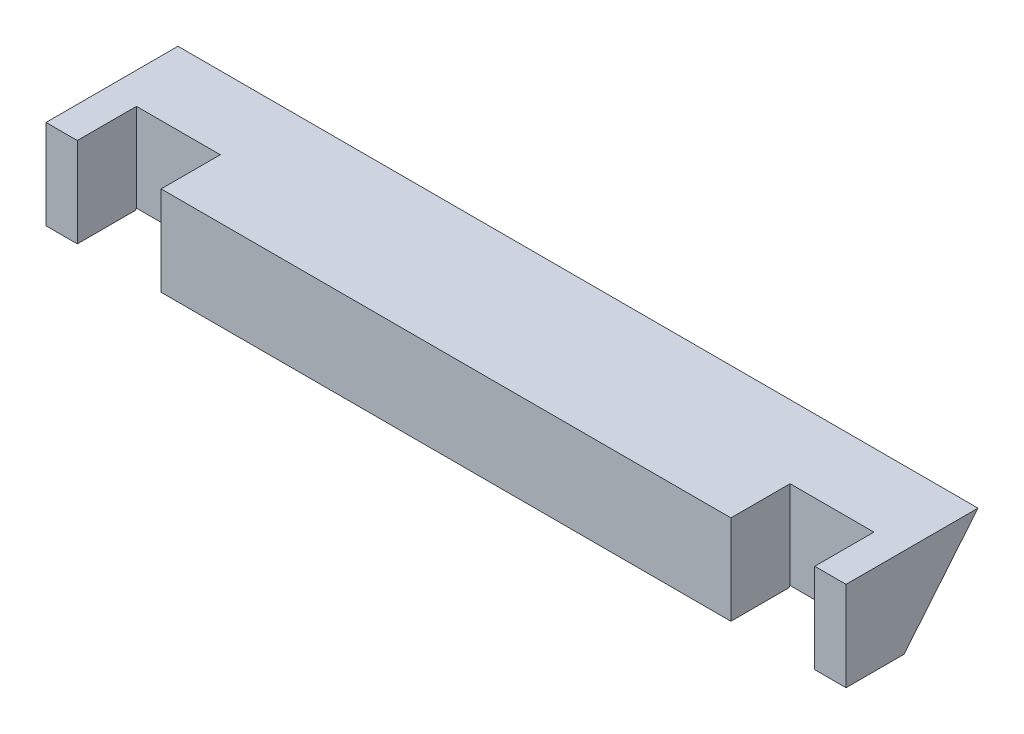
ISO-10303-21;
HEADER;
FILE_DESCRIPTION(('STEP AP214'),'2;1');
FILE_NAME('part.step','',(''),(''),'','','');
FILE_SCHEMA(('AUTOMOTIVE_DESIGN { 1 0 10303 214 1 1 1 1 }'));
ENDSEC;
DATA;
#1=APPLICATION_CONTEXT('core data for automotive mechanical design processes');
#2=APPLICATION_PROTOCOL_DEFINITION('international standard','automotive_design',2000,#1);
#3=PRODUCT_CONTEXT('',#1,'mechanical');
#4=PRODUCT('Part','Part','',(#3));
#5=PRODUCT_RELATED_PRODUCT_CATEGORY('part','',(#4));
#6=PRODUCT_DEFINITION_FORMATION('','',#4);
#7=PRODUCT_DEFINITION_CONTEXT('part definition',#1,'design');
#8=PRODUCT_DEFINITION('design','',#6,#7);
#9=PRODUCT_DEFINITION_SHAPE('','',#8);
#10=(LENGTH_UNIT() NAMED_UNIT(*) SI_UNIT(.MILLI.,.METRE.));
#11=(NAMED_UNIT(*) PLANE_ANGLE_UNIT() SI_UNIT($,.RADIAN.));
#12=(NAMED_UNIT(*) SI_UNIT($,.STERADIAN.) SOLID_ANGLE_UNIT());
#13=UNCERTAINTY_MEASURE_WITH_UNIT(LENGTH_MEASURE(1.E-05),#10,'distance_accuracy_value','');
#14=(GEOMETRIC_REPRESENTATION_CONTEXT(3) GLOBAL_UNCERTAINTY_ASSIGNED_CONTEXT((#13)) GLOBAL_UNIT_ASSIGNED_CONTEXT((#10,
#11,#12)) REPRESENTATION_CONTEXT('',''));
#15=CARTESIAN_POINT('',(0.,0.,0.));
#16=DIRECTION('',(0.,0.,1.));
#17=DIRECTION('',(1.,0.,0.));
#18=AXIS2_PLACEMENT_3D('',#15,#16,#17);
#19=CARTESIAN_POINT('',(0.,-45.987734948605,62.9188192914831));
#20=DIRECTION('',(0.,1.,0.));
#21=DIRECTION('',(0.,0.,1.));
#22=AXIS2_PLACEMENT_3D('',#19,#20,#21);
#23=PLANE('',#22);
#24=DIRECTION('',(1.,0.,0.));
#25=VECTOR('',#24,1.);
#26=CARTESIAN_POINT('',(0.,-45.987734948605,62.9188192914831));
#27=LINE('',#26,#25);
#28=CARTESIAN_POINT('',(667.81,-45.987734948605,62.9188192914831));
#29=VERTEX_POINT('',#28);
#30=CARTESIAN_POINT('',(695.,-45.987734948605,62.9188192914831));
#31=VERTEX_POINT('',#30);
#32=EDGE_CURVE('E205',#29,#31,#27,.T.);
#33=ORIENTED_EDGE('',*,*,#32,.F.);
#34=DIRECTION('',(0.,0.,-1.));
#35=VECTOR('',#34,1.);
#36=CARTESIAN_POINT('',(667.81,-45.987734948605,62.9188192914831));
#37=LINE('',#36,#35);
#38=CARTESIAN_POINT('',(667.81,-45.987734948605,12.5088192914831));
#39=VERTEX_POINT('',#38);
#40=EDGE_CURVE('E173',#29,#39,#37,.T.);
#41=ORIENTED_EDGE('',*,*,#40,.T.);
#42=DIRECTION('',(-1.,0.,0.));
#43=VECTOR('',#42,1.);
#44=CARTESIAN_POINT('',(695.,-45.987734948605,12.5088192914831));
#45=LINE('',#44,#43);
#46=CARTESIAN_POINT('',(695.,-45.987734948605,12.5088192914831));
#47=VERTEX_POINT('',#46);
#48=EDGE_CURVE('E235',#47,#39,#45,.T.);
#49=ORIENTED_EDGE('',*,*,#48,.F.);
#50=DIRECTION('',(0.,0.,-1.));
#51=VECTOR('',#50,1.);
#52=CARTESIAN_POINT('',(695.,-45.987734948605,62.9188192914831));
#53=LINE('',#52,#51);
#54=EDGE_CURVE('E217',#31,#47,#53,.T.);
#55=ORIENTED_EDGE('',*,*,#54,.F.);
#56=EDGE_LOOP('',(#33,#41,#49,#55));
#57=FACE_BOUND('',#56,.T.);
#58=ADVANCED_FACE('F34',(#57),#23,.F.);
#59=CARTESIAN_POINT('',(0.,0.,62.9188192914831));
#60=DIRECTION('',(0.,0.,1.));
#61=DIRECTION('',(1.,0.,0.));
#62=AXIS2_PLACEMENT_3D('',#59,#60,#61);
#63=PLANE('',#62);
#64=DIRECTION('',(0.,1.,0.));
#65=VECTOR('',#64,1.);
#66=CARTESIAN_POINT('',(667.81,-968.177734948605,62.9188192914831));
#67=LINE('',#66,#65);
#68=CARTESIAN_POINT('',(667.81,31.822265051395,62.9188192914831));
#69=VERTEX_POINT('',#68);
#70=EDGE_CURVE('E161',#29,#69,#67,.T.);
#71=ORIENTED_EDGE('',*,*,#70,.F.);
#72=ORIENTED_EDGE('',*,*,#32,.T.);
#73=DIRECTION('',(0.,1.,0.));
#74=VECTOR('',#73,1.);
#75=CARTESIAN_POINT('',(695.,31.822265051395,62.9188192914831));
#76=LINE('',#75,#74);
#77=CARTESIAN_POINT('',(695.,31.822265051395,62.9188192914831));
#78=VERTEX_POINT('',#77);
#79=EDGE_CURVE('E209',#31,#78,#76,.T.);
#80=ORIENTED_EDGE('',*,*,#79,.T.);
#81=DIRECTION('',(-1.,0.,0.));
#82=VECTOR('',#81,1.);
#83=CARTESIAN_POINT('',(0.,31.822265051395,62.9188192914831));
#84=LINE('',#83,#82);
#85=EDGE_CURVE('E214',#78,#69,#84,.T.);
#86=ORIENTED_EDGE('',*,*,#85,.T.);
#87=EDGE_LOOP('',(#71,#72,#80,#86));
#88=FACE_BOUND('',#87,.T.);
#89=ADVANCED_FACE('F270',(#88),#63,.T.);
#90=CARTESIAN_POINT('',(594.99,-45.987734948605,12.5088192914831));
#91=VERTEX_POINT('',#90);
#92=CARTESIAN_POINT('',(100.01,-45.987734948605,12.5088192914831));
#93=VERTEX_POINT('',#92);
#94=EDGE_CURVE('E239',#91,#93,#45,.T.);
#95=ORIENTED_EDGE('',*,*,#94,.F.);
#96=DIRECTION('',(0.,0.,1.));
#97=VECTOR('',#96,1.);
#98=CARTESIAN_POINT('',(594.99,-45.987734948605,62.9188192914831));
#99=LINE('',#98,#97);
#100=CARTESIAN_POINT('',(594.99,-45.987734948605,62.9188192914831));
#101=VERTEX_POINT('',#100);
#102=EDGE_CURVE('E167',#91,#101,#99,.T.);
#103=ORIENTED_EDGE('',*,*,#102,.T.);
#104=CARTESIAN_POINT('',(100.01,-45.987734948605,62.9188192914831));
#105=VERTEX_POINT('',#104);
#106=EDGE_CURVE('E210',#105,#101,#27,.T.);
#107=ORIENTED_EDGE('',*,*,#106,.F.);
#108=DIRECTION('',(0.,0.,-1.));
#109=VECTOR('',#108,1.);
#110=CARTESIAN_POINT('',(100.01,-45.987734948605,62.9188192914831));
#111=LINE('',#110,#109);
#112=EDGE_CURVE('E193',#105,#93,#111,.T.);
#113=ORIENTED_EDGE('',*,*,#112,.T.);
#114=EDGE_LOOP('',(#95,#103,#107,#113));
#115=FACE_BOUND('',#114,.T.);
#116=ADVANCED_FACE('F263',(#115),#23,.F.);
#117=DIRECTION('',(0.,1.,0.));
#118=VECTOR('',#117,1.);
#119=CARTESIAN_POINT('',(594.99,-968.177734948605,62.9188192914831));
#120=LINE('',#119,#118);
#121=CARTESIAN_POINT('',(594.99,31.822265051395,62.9188192914831));
#122=VERTEX_POINT('',#121);
#123=EDGE_CURVE('E145',#101,#122,#120,.T.);
#124=ORIENTED_EDGE('',*,*,#123,.T.);
#125=CARTESIAN_POINT('',(100.01,31.822265051395,62.9188192914831));
#126=VERTEX_POINT('',#125);
#127=EDGE_CURVE('E156',#122,#126,#84,.T.);
#128=ORIENTED_EDGE('',*,*,#127,.T.);
#129=DIRECTION('',(0.,1.,0.));
#130=VECTOR('',#129,1.);
#131=CARTESIAN_POINT('',(100.01,0.,62.9188192914831));
#132=LINE('',#131,#130);
#133=EDGE_CURVE('E11',#105,#126,#132,.T.);
#134=ORIENTED_EDGE('',*,*,#133,.F.);
#135=ORIENTED_EDGE('',*,*,#106,.T.);
#136=EDGE_LOOP('',(#124,#128,#134,#135));
#137=FACE_BOUND('',#136,.T.);
#138=ADVANCED_FACE('F278',(#137),#63,.T.);
#139=CARTESIAN_POINT('',(695.,-45.987734948605,12.5088192914831));
#140=DIRECTION('',(0.,0.636540705826315,0.771243106825686));
#141=DIRECTION('',(0.,-0.771243106825686,0.636540705826315));
#142=AXIS2_PLACEMENT_3D('',#139,#140,#141);
#143=PLANE('',#142);
#144=ORIENTED_EDGE('',*,*,#48,.T.);
#145=DIRECTION('',(0.,0.771243106825686,-0.636540705826315));
#146=VECTOR('',#145,1.);
#147=CARTESIAN_POINT('',(667.81,-45.987734948605,12.5088192914831));
#148=LINE('',#147,#146);
#149=CARTESIAN_POINT('',(667.81,-44.7882347928903,11.5188192914831));
#150=VERTEX_POINT('',#149);
#151=EDGE_CURVE('E170',#39,#150,#148,.T.);
#152=ORIENTED_EDGE('',*,*,#151,.T.);
#153=DIRECTION('',(-1.,0.,0.));
#154=VECTOR('',#153,1.);
#155=CARTESIAN_POINT('',(695.,-44.7882347928903,11.5188192914831));
#156=LINE('',#155,#154);
#157=CARTESIAN_POINT('',(594.99,-44.7882347928903,11.5188192914831));
#158=VERTEX_POINT('',#157);
#159=EDGE_CURVE('E163',#150,#158,#156,.T.);
#160=ORIENTED_EDGE('',*,*,#159,.T.);
#161=DIRECTION('',(0.,-0.771243106825686,0.636540705826315));
#162=VECTOR('',#161,1.);
#163=CARTESIAN_POINT('',(594.99,-45.987734948605,12.5088192914831));
#164=LINE('',#163,#162);
#165=EDGE_CURVE('E142',#158,#91,#164,.T.);
#166=ORIENTED_EDGE('',*,*,#165,.T.);
#167=ORIENTED_EDGE('',*,*,#94,.T.);
#168=DIRECTION('',(0.,0.771243106825686,-0.636540705826315));
#169=VECTOR('',#168,1.);
#170=CARTESIAN_POINT('',(100.01,-45.987734948605,12.5088192914831));
#171=LINE('',#170,#169);
#172=CARTESIAN_POINT('',(100.01,-44.7882347928903,11.5188192914831));
#173=VERTEX_POINT('',#172);
#174=EDGE_CURVE('E196',#93,#173,#171,.T.);
#175=ORIENTED_EDGE('',*,*,#174,.T.);
#176=DIRECTION('',(-1.,0.,0.));
#177=VECTOR('',#176,1.);
#178=CARTESIAN_POINT('',(695.,-44.7882347928902,11.5188192914831));
#179=LINE('',#178,#177);
#180=CARTESIAN_POINT('',(27.19,-44.7882347928903,11.5188192914831));
#181=VERTEX_POINT('',#180);
#182=EDGE_CURVE('E199',#173,#181,#179,.T.);
#183=ORIENTED_EDGE('',*,*,#182,.T.);
#184=DIRECTION('',(0.,-0.771243106825686,0.636540705826315));
#185=VECTOR('',#184,1.);
#186=CARTESIAN_POINT('',(27.19,-45.987734948605,12.5088192914831));
#187=LINE('',#186,#185);
#188=CARTESIAN_POINT('',(27.19,-45.987734948605,12.5088192914831));
#189=VERTEX_POINT('',#188);
#190=EDGE_CURVE('E190',#181,#189,#187,.T.);
#191=ORIENTED_EDGE('',*,*,#190,.T.);
#192=CARTESIAN_POINT('',(0.,-45.987734948605,12.5088192914831));
#193=VERTEX_POINT('',#192);
#194=EDGE_CURVE('E230',#189,#193,#45,.T.);
#195=ORIENTED_EDGE('',*,*,#194,.T.);
#196=DIRECTION('',(0.,0.771243106825686,-0.636540705826315));
#197=VECTOR('',#196,1.);
#198=CARTESIAN_POINT('',(0.,-45.987734948605,12.5088192914831));
#199=LINE('',#198,#197);
#200=CARTESIAN_POINT('',(0.,31.822265051395,-51.7111807085169));
#201=VERTEX_POINT('',#200);
#202=EDGE_CURVE('E223',#193,#201,#199,.T.);
#203=ORIENTED_EDGE('',*,*,#202,.T.);
#204=DIRECTION('',(-1.,0.,0.));
#205=VECTOR('',#204,1.);
#206=CARTESIAN_POINT('',(695.,31.822265051395,-51.7111807085169));
#207=LINE('',#206,#205);
#208=CARTESIAN_POINT('',(695.,31.822265051395,-51.7111807085169));
#209=VERTEX_POINT('',#208);
#210=EDGE_CURVE('E238',#209,#201,#207,.T.);
#211=ORIENTED_EDGE('',*,*,#210,.F.);
#212=DIRECTION('',(0.,0.771243106825686,-0.636540705826315));
#213=VECTOR('',#212,1.);
#214=CARTESIAN_POINT('',(695.,-45.987734948605,12.5088192914831));
#215=LINE('',#214,#213);
#216=EDGE_CURVE('E224',#47,#209,#215,.T.);
#217=ORIENTED_EDGE('',*,*,#216,.F.);
#218=EDGE_LOOP('',(#144,#152,#160,#166,#167,#175,#183,#191,#195,#203,#211,#217));
#219=FACE_BOUND('',#218,.T.);
#220=ADVANCED_FACE('F36',(#219),#143,.F.);
#221=CARTESIAN_POINT('',(695.,31.822265051395,-51.7111807085169));
#222=DIRECTION('',(0.,-1.,0.));
#223=DIRECTION('',(0.,0.,-1.));
#224=AXIS2_PLACEMENT_3D('',#221,#222,#223);
#225=PLANE('',#224);
#226=DIRECTION('',(-1.,0.,0.));
#227=VECTOR('',#226,1.);
#228=CARTESIAN_POINT('',(667.81,31.822265051395,11.5188192914831));
#229=LINE('',#228,#227);
#230=CARTESIAN_POINT('',(667.81,31.822265051395,11.5188192914831));
#231=VERTEX_POINT('',#230);
#232=CARTESIAN_POINT('',(594.99,31.822265051395,11.5188192914831));
#233=VERTEX_POINT('',#232);
#234=EDGE_CURVE('E149',#231,#233,#229,.T.);
#235=ORIENTED_EDGE('',*,*,#234,.F.);
#236=DIRECTION('',(0.,0.,-1.));
#237=VECTOR('',#236,1.);
#238=CARTESIAN_POINT('',(667.81,31.822265051395,62.9188192914831));
#239=LINE('',#238,#237);
#240=EDGE_CURVE('E49',#69,#231,#239,.T.);
#241=ORIENTED_EDGE('',*,*,#240,.F.);
#242=ORIENTED_EDGE('',*,*,#85,.F.);
#243=DIRECTION('',(0.,0.,1.));
#244=VECTOR('',#243,1.);
#245=CARTESIAN_POINT('',(695.,31.822265051395,-51.7111807085169));
#246=LINE('',#245,#244);
#247=EDGE_CURVE('E227',#209,#78,#246,.T.);
#248=ORIENTED_EDGE('',*,*,#247,.F.);
#249=ORIENTED_EDGE('',*,*,#210,.T.);
#250=DIRECTION('',(0.,0.,1.));
#251=VECTOR('',#250,1.);
#252=CARTESIAN_POINT('',(0.,31.822265051395,-51.7111807085169));
#253=LINE('',#252,#251);
#254=CARTESIAN_POINT('',(0.,31.822265051395,62.9188192914831));
#255=VERTEX_POINT('',#254);
#256=EDGE_CURVE('E228',#201,#255,#253,.T.);
#257=ORIENTED_EDGE('',*,*,#256,.T.);
#258=CARTESIAN_POINT('',(27.19,31.822265051395,62.9188192914831));
#259=VERTEX_POINT('',#258);
#260=EDGE_CURVE('E213',#259,#255,#84,.T.);
#261=ORIENTED_EDGE('',*,*,#260,.F.);
#262=DIRECTION('',(0.,0.,1.));
#263=VECTOR('',#262,1.);
#264=CARTESIAN_POINT('',(27.19,31.822265051395,62.9188192914831));
#265=LINE('',#264,#263);
#266=CARTESIAN_POINT('',(27.19,31.822265051395,11.5188192914831));
#267=VERTEX_POINT('',#266);
#268=EDGE_CURVE('E57',#267,#259,#265,.T.);
#269=ORIENTED_EDGE('',*,*,#268,.F.);
#270=DIRECTION('',(-1.,0.,0.));
#271=VECTOR('',#270,1.);
#272=CARTESIAN_POINT('',(100.01,31.822265051395,11.5188192914831));
#273=LINE('',#272,#271);
#274=CARTESIAN_POINT('',(100.01,31.822265051395,11.5188192914831));
#275=VERTEX_POINT('',#274);
#276=EDGE_CURVE('E179',#275,#267,#273,.T.);
#277=ORIENTED_EDGE('',*,*,#276,.F.);
#278=DIRECTION('',(0.,0.,-1.));
#279=VECTOR('',#278,1.);
#280=CARTESIAN_POINT('',(100.01,31.822265051395,62.9188192914831));
#281=LINE('',#280,#279);
#282=EDGE_CURVE('E176',#126,#275,#281,.T.);
#283=ORIENTED_EDGE('',*,*,#282,.F.);
#284=ORIENTED_EDGE('',*,*,#127,.F.);
#285=DIRECTION('',(0.,0.,1.));
#286=VECTOR('',#285,1.);
#287=CARTESIAN_POINT('',(594.99,31.822265051395,62.9188192914831));
#288=LINE('',#287,#286);
#289=EDGE_CURVE('E139',#233,#122,#288,.T.);
#290=ORIENTED_EDGE('',*,*,#289,.F.);
#291=EDGE_LOOP('',(#235,#241,#242,#248,#249,#257,#261,#269,#277,#283,#284,#290));
#292=FACE_BOUND('',#291,.T.);
#293=ADVANCED_FACE('F154',(#292),#225,.F.);
#294=CARTESIAN_POINT('',(695.,0.,0.));
#295=DIRECTION('',(1.,0.,0.));
#296=DIRECTION('',(0.,0.,-1.));
#297=AXIS2_PLACEMENT_3D('',#294,#295,#296);
#298=PLANE('',#297);
#299=ORIENTED_EDGE('',*,*,#216,.T.);
#300=ORIENTED_EDGE('',*,*,#247,.T.);
#301=ORIENTED_EDGE('',*,*,#79,.F.);
#302=ORIENTED_EDGE('',*,*,#54,.T.);
#303=EDGE_LOOP('',(#299,#300,#301,#302));
#304=FACE_BOUND('',#303,.T.);
#305=ADVANCED_FACE('F276',(#304),#298,.T.);
#306=CARTESIAN_POINT('',(0.,0.,0.));
#307=DIRECTION('',(1.,0.,0.));
#308=DIRECTION('',(0.,0.,-1.));
#309=AXIS2_PLACEMENT_3D('',#306,#307,#308);
#310=PLANE('',#309);
#311=ORIENTED_EDGE('',*,*,#202,.F.);
#312=DIRECTION('',(0.,0.,-1.));
#313=VECTOR('',#312,1.);
#314=CARTESIAN_POINT('',(0.,-45.987734948605,62.9188192914831));
#315=LINE('',#314,#313);
#316=CARTESIAN_POINT('',(0.,-45.987734948605,62.9188192914831));
#317=VERTEX_POINT('',#316);
#318=EDGE_CURVE('E220',#317,#193,#315,.T.);
#319=ORIENTED_EDGE('',*,*,#318,.F.);
#320=DIRECTION('',(0.,-1.,0.));
#321=VECTOR('',#320,1.);
#322=CARTESIAN_POINT('',(0.,31.822265051395,62.9188192914831));
#323=LINE('',#322,#321);
#324=EDGE_CURVE('E202',#255,#317,#323,.T.);
#325=ORIENTED_EDGE('',*,*,#324,.F.);
#326=ORIENTED_EDGE('',*,*,#256,.F.);
#327=EDGE_LOOP('',(#311,#319,#325,#326));
#328=FACE_BOUND('',#327,.T.);
#329=ADVANCED_FACE('F252',(#328),#310,.F.);
#330=ORIENTED_EDGE('',*,*,#194,.F.);
#331=DIRECTION('',(0.,0.,1.));
#332=VECTOR('',#331,1.);
#333=CARTESIAN_POINT('',(27.19,-45.987734948605,62.9188192914831));
#334=LINE('',#333,#332);
#335=CARTESIAN_POINT('',(27.19,-45.987734948605,62.9188192914831));
#336=VERTEX_POINT('',#335);
#337=EDGE_CURVE('E186',#189,#336,#334,.T.);
#338=ORIENTED_EDGE('',*,*,#337,.T.);
#339=EDGE_CURVE('E206',#317,#336,#27,.T.);
#340=ORIENTED_EDGE('',*,*,#339,.F.);
#341=ORIENTED_EDGE('',*,*,#318,.T.);
#342=EDGE_LOOP('',(#330,#338,#340,#341));
#343=FACE_BOUND('',#342,.T.);
#344=ADVANCED_FACE('F246',(#343),#23,.F.);
#345=DIRECTION('',(0.,-1.,0.));
#346=VECTOR('',#345,1.);
#347=CARTESIAN_POINT('',(27.19,0.,62.9188192914831));
#348=LINE('',#347,#346);
#349=EDGE_CURVE('E42',#259,#336,#348,.T.);
#350=ORIENTED_EDGE('',*,*,#349,.F.);
#351=ORIENTED_EDGE('',*,*,#260,.T.);
#352=ORIENTED_EDGE('',*,*,#324,.T.);
#353=ORIENTED_EDGE('',*,*,#339,.T.);
#354=EDGE_LOOP('',(#350,#351,#352,#353));
#355=FACE_BOUND('',#354,.T.);
#356=ADVANCED_FACE('F247',(#355),#63,.T.);
#357=CARTESIAN_POINT('',(100.01,-968.177734948605,11.5188192914831));
#358=DIRECTION('',(0.,0.,-1.));
#359=DIRECTION('',(-1.,0.,0.));
#360=AXIS2_PLACEMENT_3D('',#357,#358,#359);
#361=PLANE('',#360);
#362=DIRECTION('',(0.,1.,0.));
#363=VECTOR('',#362,1.);
#364=CARTESIAN_POINT('',(100.01,-968.177734948605,11.5188192914831));
#365=LINE('',#364,#363);
#366=EDGE_CURVE('E183',#173,#275,#365,.T.);
#367=ORIENTED_EDGE('',*,*,#366,.T.);
#368=ORIENTED_EDGE('',*,*,#276,.T.);
#369=DIRECTION('',(0.,1.,0.));
#370=VECTOR('',#369,1.);
#371=CARTESIAN_POINT('',(27.19,-968.177734948605,11.5188192914831));
#372=LINE('',#371,#370);
#373=EDGE_CURVE('E184',#181,#267,#372,.T.);
#374=ORIENTED_EDGE('',*,*,#373,.F.);
#375=ORIENTED_EDGE('',*,*,#182,.F.);
#376=EDGE_LOOP('',(#367,#368,#374,#375));
#377=FACE_BOUND('',#376,.T.);
#378=ADVANCED_FACE('F281',(#377),#361,.F.);
#379=CARTESIAN_POINT('',(100.01,-968.177734948605,62.9188192914831));
#380=DIRECTION('',(1.,0.,0.));
#381=DIRECTION('',(0.,0.,-1.));
#382=AXIS2_PLACEMENT_3D('',#379,#380,#381);
#383=PLANE('',#382);
#384=ORIENTED_EDGE('',*,*,#112,.F.);
#385=ORIENTED_EDGE('',*,*,#133,.T.);
#386=ORIENTED_EDGE('',*,*,#282,.T.);
#387=ORIENTED_EDGE('',*,*,#366,.F.);
#388=ORIENTED_EDGE('',*,*,#174,.F.);
#389=EDGE_LOOP('',(#384,#385,#386,#387,#388));
#390=FACE_BOUND('',#389,.T.);
#391=ADVANCED_FACE('F260',(#390),#383,.F.);
#392=CARTESIAN_POINT('',(27.19,-968.177734948605,62.9188192914831));
#393=DIRECTION('',(-1.,0.,0.));
#394=DIRECTION('',(0.,0.,1.));
#395=AXIS2_PLACEMENT_3D('',#392,#393,#394);
#396=PLANE('',#395);
#397=ORIENTED_EDGE('',*,*,#373,.T.);
#398=ORIENTED_EDGE('',*,*,#268,.T.);
#399=ORIENTED_EDGE('',*,*,#349,.T.);
#400=ORIENTED_EDGE('',*,*,#337,.F.);
#401=ORIENTED_EDGE('',*,*,#190,.F.);
#402=EDGE_LOOP('',(#397,#398,#399,#400,#401));
#403=FACE_BOUND('',#402,.T.);
#404=ADVANCED_FACE('F241',(#403),#396,.F.);
#405=CARTESIAN_POINT('',(667.81,-968.177734948605,62.9188192914831));
#406=DIRECTION('',(1.,0.,0.));
#407=DIRECTION('',(0.,0.,-1.));
#408=AXIS2_PLACEMENT_3D('',#405,#406,#407);
#409=PLANE('',#408);
#410=ORIENTED_EDGE('',*,*,#70,.T.);
#411=ORIENTED_EDGE('',*,*,#240,.T.);
#412=DIRECTION('',(0.,1.,0.));
#413=VECTOR('',#412,1.);
#414=CARTESIAN_POINT('',(667.81,-968.177734948605,11.5188192914831));
#415=LINE('',#414,#413);
#416=EDGE_CURVE('E146',#150,#231,#415,.T.);
#417=ORIENTED_EDGE('',*,*,#416,.F.);
#418=ORIENTED_EDGE('',*,*,#151,.F.);
#419=ORIENTED_EDGE('',*,*,#40,.F.);
#420=EDGE_LOOP('',(#410,#411,#417,#418,#419));
#421=FACE_BOUND('',#420,.T.);
#422=ADVANCED_FACE('F337',(#421),#409,.F.);
#423=CARTESIAN_POINT('',(594.99,-968.177734948605,62.9188192914831));
#424=DIRECTION('',(-1.,0.,0.));
#425=DIRECTION('',(0.,0.,1.));
#426=AXIS2_PLACEMENT_3D('',#423,#424,#425);
#427=PLANE('',#426);
#428=ORIENTED_EDGE('',*,*,#165,.F.);
#429=DIRECTION('',(0.,1.,0.));
#430=VECTOR('',#429,1.);
#431=CARTESIAN_POINT('',(594.99,-968.177734948605,11.5188192914831));
#432=LINE('',#431,#430);
#433=EDGE_CURVE('E135',#158,#233,#432,.T.);
#434=ORIENTED_EDGE('',*,*,#433,.T.);
#435=ORIENTED_EDGE('',*,*,#289,.T.);
#436=ORIENTED_EDGE('',*,*,#123,.F.);
#437=ORIENTED_EDGE('',*,*,#102,.F.);
#438=EDGE_LOOP('',(#428,#434,#435,#436,#437));
#439=FACE_BOUND('',#438,.T.);
#440=ADVANCED_FACE('F137',(#439),#427,.F.);
#441=CARTESIAN_POINT('',(667.81,-968.177734948605,11.5188192914831));
#442=DIRECTION('',(0.,0.,-1.));
#443=DIRECTION('',(-1.,0.,0.));
#444=AXIS2_PLACEMENT_3D('',#441,#442,#443);
#445=PLANE('',#444);
#446=ORIENTED_EDGE('',*,*,#416,.T.);
#447=ORIENTED_EDGE('',*,*,#234,.T.);
#448=ORIENTED_EDGE('',*,*,#433,.F.);
#449=ORIENTED_EDGE('',*,*,#159,.F.);
#450=EDGE_LOOP('',(#446,#447,#448,#449));
#451=FACE_BOUND('',#450,.T.);
#452=ADVANCED_FACE('F150',(#451),#445,.F.);
#453=CLOSED_SHELL('',(#58,#89,#116,#138,#220,#293,#305,#329,#344,#356,#378,#391,#404,#422,#440,#452));
#454=MANIFOLD_SOLID_BREP('B2',#453);
#455=ADVANCED_BREP_SHAPE_REPRESENTATION('',(#18,#454),#14);
#456=SHAPE_DEFINITION_REPRESENTATION(#9,#455);
ENDSEC;
END-ISO-10303-21;
